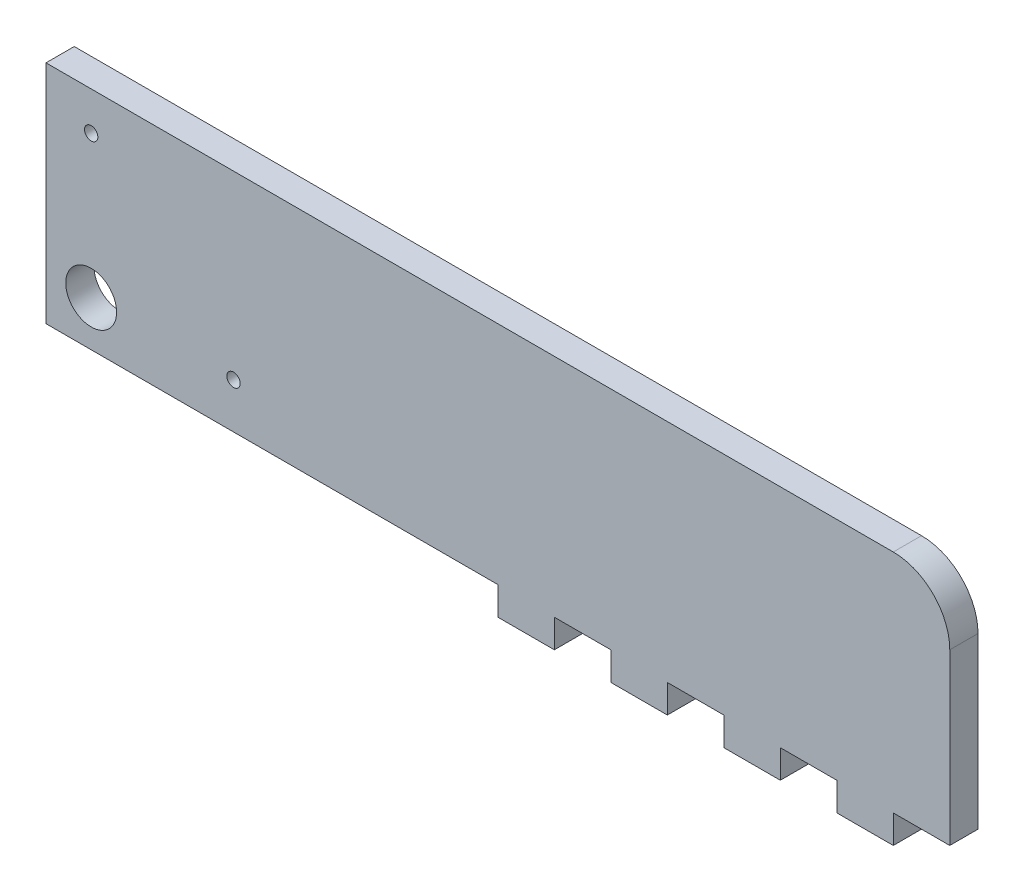
ISO-10303-21;
HEADER;
FILE_DESCRIPTION(('STEP AP214'),'2;1');
FILE_NAME('part.step','',(''),(''),'','','');
FILE_SCHEMA(('AUTOMOTIVE_DESIGN { 1 0 10303 214 1 1 1 1 }'));
ENDSEC;
DATA;
#1=APPLICATION_CONTEXT('core data for automotive mechanical design processes');
#2=APPLICATION_PROTOCOL_DEFINITION('international standard','automotive_design',2000,#1);
#3=PRODUCT_CONTEXT('',#1,'mechanical');
#4=PRODUCT('Part','Part','',(#3));
#5=PRODUCT_RELATED_PRODUCT_CATEGORY('part','',(#4));
#6=PRODUCT_DEFINITION_FORMATION('','',#4);
#7=PRODUCT_DEFINITION_CONTEXT('part definition',#1,'design');
#8=PRODUCT_DEFINITION('design','',#6,#7);
#9=PRODUCT_DEFINITION_SHAPE('','',#8);
#10=(LENGTH_UNIT() NAMED_UNIT(*) SI_UNIT(.MILLI.,.METRE.));
#11=(NAMED_UNIT(*) PLANE_ANGLE_UNIT() SI_UNIT($,.RADIAN.));
#12=(NAMED_UNIT(*) SI_UNIT($,.STERADIAN.) SOLID_ANGLE_UNIT());
#13=UNCERTAINTY_MEASURE_WITH_UNIT(LENGTH_MEASURE(1.E-05),#10,'distance_accuracy_value','');
#14=(GEOMETRIC_REPRESENTATION_CONTEXT(3) GLOBAL_UNCERTAINTY_ASSIGNED_CONTEXT((#13)) GLOBAL_UNIT_ASSIGNED_CONTEXT((#10,
#11,#12)) REPRESENTATION_CONTEXT('',''));
#15=CARTESIAN_POINT('',(0.,0.,0.));
#16=DIRECTION('',(0.,0.,1.));
#17=DIRECTION('',(1.,0.,0.));
#18=AXIS2_PLACEMENT_3D('',#15,#16,#17);
#19=CARTESIAN_POINT('',(0.,25.4,3.175));
#20=DIRECTION('',(0.,0.,-1.));
#21=DIRECTION('',(-1.,0.,0.));
#22=AXIS2_PLACEMENT_3D('',#19,#20,#21);
#23=PLANE('',#22);
#24=CARTESIAN_POINT('',(5.08,21.08,3.175));
#25=DIRECTION('',(0.,0.,1.));
#26=DIRECTION('',(1.,0.,0.));
#27=AXIS2_PLACEMENT_3D('',#24,#25,#26);
#28=CIRCLE('',#27,0.75);
#29=CARTESIAN_POINT('',(5.83,21.08,3.175));
#30=VERTEX_POINT('',#29);
#31=EDGE_CURVE('E334',#30,#30,#28,.T.);
#32=ORIENTED_EDGE('',*,*,#31,.F.);
#33=EDGE_LOOP('',(#32));
#34=FACE_BOUND('',#33,.T.);
#35=DIRECTION('',(0.,1.,0.));
#36=VECTOR('',#35,1.);
#37=CARTESIAN_POINT('',(101.6,0.,3.175));
#38=LINE('',#37,#36);
#39=CARTESIAN_POINT('',(101.6,0.,3.175));
#40=VERTEX_POINT('',#39);
#41=CARTESIAN_POINT('',(101.6,19.05,3.175));
#42=VERTEX_POINT('',#41);
#43=EDGE_CURVE('E298',#40,#42,#38,.T.);
#44=ORIENTED_EDGE('',*,*,#43,.T.);
#45=CARTESIAN_POINT('',(95.25,19.05,3.175));
#46=DIRECTION('',(0.,0.,-1.));
#47=DIRECTION('',(-1.,0.,0.));
#48=AXIS2_PLACEMENT_3D('',#45,#46,#47);
#49=CIRCLE('',#48,6.35);
#50=CARTESIAN_POINT('',(95.25,25.4,3.175));
#51=VERTEX_POINT('',#50);
#52=EDGE_CURVE('E11',#42,#51,#49,.F.);
#53=ORIENTED_EDGE('',*,*,#52,.T.);
#54=DIRECTION('',(-1.,0.,0.));
#55=VECTOR('',#54,1.);
#56=CARTESIAN_POINT('',(0.,25.4,3.175));
#57=LINE('',#56,#55);
#58=CARTESIAN_POINT('',(0.,25.4,3.175));
#59=VERTEX_POINT('',#58);
#60=EDGE_CURVE('E192',#51,#59,#57,.T.);
#61=ORIENTED_EDGE('',*,*,#60,.T.);
#62=DIRECTION('',(0.,-1.,0.));
#63=VECTOR('',#62,1.);
#64=CARTESIAN_POINT('',(0.,0.,3.175));
#65=LINE('',#64,#63);
#66=CARTESIAN_POINT('',(0.,0.,3.175));
#67=VERTEX_POINT('',#66);
#68=EDGE_CURVE('E187',#59,#67,#65,.T.);
#69=ORIENTED_EDGE('',*,*,#68,.T.);
#70=DIRECTION('',(1.,0.,0.));
#71=VECTOR('',#70,1.);
#72=CARTESIAN_POINT('',(0.,0.,3.175));
#73=LINE('',#72,#71);
#74=CARTESIAN_POINT('',(50.8,0.,3.175));
#75=VERTEX_POINT('',#74);
#76=EDGE_CURVE('E176',#67,#75,#73,.T.);
#77=ORIENTED_EDGE('',*,*,#76,.T.);
#78=DIRECTION('',(0.,-1.,0.));
#79=VECTOR('',#78,1.);
#80=CARTESIAN_POINT('',(50.8,-3.17500000000001,3.175));
#81=LINE('',#80,#79);
#82=CARTESIAN_POINT('',(50.8,-3.17500000000001,3.175));
#83=VERTEX_POINT('',#82);
#84=EDGE_CURVE('E186',#75,#83,#81,.T.);
#85=ORIENTED_EDGE('',*,*,#84,.T.);
#86=DIRECTION('',(1.,0.,0.));
#87=VECTOR('',#86,1.);
#88=CARTESIAN_POINT('',(57.15,-3.175,3.175));
#89=LINE('',#88,#87);
#90=CARTESIAN_POINT('',(57.15,-3.175,3.175));
#91=VERTEX_POINT('',#90);
#92=EDGE_CURVE('E328',#83,#91,#89,.T.);
#93=ORIENTED_EDGE('',*,*,#92,.T.);
#94=DIRECTION('',(0.,1.,0.));
#95=VECTOR('',#94,1.);
#96=CARTESIAN_POINT('',(57.15,0.,3.175));
#97=LINE('',#96,#95);
#98=CARTESIAN_POINT('',(57.15,0.,3.175));
#99=VERTEX_POINT('',#98);
#100=EDGE_CURVE('E326',#91,#99,#97,.T.);
#101=ORIENTED_EDGE('',*,*,#100,.T.);
#102=DIRECTION('',(1.,0.,0.));
#103=VECTOR('',#102,1.);
#104=CARTESIAN_POINT('',(57.15,0.,3.175));
#105=LINE('',#104,#103);
#106=CARTESIAN_POINT('',(63.5,0.,3.175));
#107=VERTEX_POINT('',#106);
#108=EDGE_CURVE('E324',#99,#107,#105,.T.);
#109=ORIENTED_EDGE('',*,*,#108,.T.);
#110=DIRECTION('',(0.,-1.,0.));
#111=VECTOR('',#110,1.);
#112=CARTESIAN_POINT('',(63.5,-3.175,3.175));
#113=LINE('',#112,#111);
#114=CARTESIAN_POINT('',(63.5,-3.175,3.175));
#115=VERTEX_POINT('',#114);
#116=EDGE_CURVE('E322',#107,#115,#113,.T.);
#117=ORIENTED_EDGE('',*,*,#116,.T.);
#118=DIRECTION('',(1.,0.,0.));
#119=VECTOR('',#118,1.);
#120=CARTESIAN_POINT('',(69.85,-3.175,3.175));
#121=LINE('',#120,#119);
#122=CARTESIAN_POINT('',(69.85,-3.175,3.175));
#123=VERTEX_POINT('',#122);
#124=EDGE_CURVE('E320',#115,#123,#121,.T.);
#125=ORIENTED_EDGE('',*,*,#124,.T.);
#126=DIRECTION('',(0.,1.,0.));
#127=VECTOR('',#126,1.);
#128=CARTESIAN_POINT('',(69.85,0.,3.175));
#129=LINE('',#128,#127);
#130=CARTESIAN_POINT('',(69.85,0.,3.175));
#131=VERTEX_POINT('',#130);
#132=EDGE_CURVE('E318',#123,#131,#129,.T.);
#133=ORIENTED_EDGE('',*,*,#132,.T.);
#134=DIRECTION('',(1.,0.,0.));
#135=VECTOR('',#134,1.);
#136=CARTESIAN_POINT('',(69.85,0.,3.175));
#137=LINE('',#136,#135);
#138=CARTESIAN_POINT('',(76.2,0.,3.175));
#139=VERTEX_POINT('',#138);
#140=EDGE_CURVE('E316',#131,#139,#137,.T.);
#141=ORIENTED_EDGE('',*,*,#140,.T.);
#142=DIRECTION('',(0.,-1.,0.));
#143=VECTOR('',#142,1.);
#144=CARTESIAN_POINT('',(76.2,-3.175,3.175));
#145=LINE('',#144,#143);
#146=CARTESIAN_POINT('',(76.2,-3.175,3.175));
#147=VERTEX_POINT('',#146);
#148=EDGE_CURVE('E314',#139,#147,#145,.T.);
#149=ORIENTED_EDGE('',*,*,#148,.T.);
#150=DIRECTION('',(1.,0.,0.));
#151=VECTOR('',#150,1.);
#152=CARTESIAN_POINT('',(82.55,-3.175,3.175));
#153=LINE('',#152,#151);
#154=CARTESIAN_POINT('',(82.55,-3.175,3.175));
#155=VERTEX_POINT('',#154);
#156=EDGE_CURVE('E312',#147,#155,#153,.T.);
#157=ORIENTED_EDGE('',*,*,#156,.T.);
#158=DIRECTION('',(0.,1.,0.));
#159=VECTOR('',#158,1.);
#160=CARTESIAN_POINT('',(82.55,0.,3.175));
#161=LINE('',#160,#159);
#162=CARTESIAN_POINT('',(82.55,0.,3.175));
#163=VERTEX_POINT('',#162);
#164=EDGE_CURVE('E310',#155,#163,#161,.T.);
#165=ORIENTED_EDGE('',*,*,#164,.T.);
#166=DIRECTION('',(1.,0.,0.));
#167=VECTOR('',#166,1.);
#168=CARTESIAN_POINT('',(82.55,0.,3.175));
#169=LINE('',#168,#167);
#170=CARTESIAN_POINT('',(88.9,0.,3.175));
#171=VERTEX_POINT('',#170);
#172=EDGE_CURVE('E308',#163,#171,#169,.T.);
#173=ORIENTED_EDGE('',*,*,#172,.T.);
#174=DIRECTION('',(0.,-1.,0.));
#175=VECTOR('',#174,1.);
#176=CARTESIAN_POINT('',(88.9,-3.175,3.175));
#177=LINE('',#176,#175);
#178=CARTESIAN_POINT('',(88.9,-3.175,3.175));
#179=VERTEX_POINT('',#178);
#180=EDGE_CURVE('E306',#171,#179,#177,.T.);
#181=ORIENTED_EDGE('',*,*,#180,.T.);
#182=DIRECTION('',(1.,0.,0.));
#183=VECTOR('',#182,1.);
#184=CARTESIAN_POINT('',(95.25,-3.175,3.175));
#185=LINE('',#184,#183);
#186=CARTESIAN_POINT('',(95.25,-3.175,3.175));
#187=VERTEX_POINT('',#186);
#188=EDGE_CURVE('E304',#179,#187,#185,.T.);
#189=ORIENTED_EDGE('',*,*,#188,.T.);
#190=DIRECTION('',(0.,1.,0.));
#191=VECTOR('',#190,1.);
#192=CARTESIAN_POINT('',(95.25,0.,3.175));
#193=LINE('',#192,#191);
#194=CARTESIAN_POINT('',(95.25,0.,3.175));
#195=VERTEX_POINT('',#194);
#196=EDGE_CURVE('E302',#187,#195,#193,.T.);
#197=ORIENTED_EDGE('',*,*,#196,.T.);
#198=DIRECTION('',(1.,0.,0.));
#199=VECTOR('',#198,1.);
#200=CARTESIAN_POINT('',(95.25,0.,3.175));
#201=LINE('',#200,#199);
#202=EDGE_CURVE('E300',#195,#40,#201,.T.);
#203=ORIENTED_EDGE('',*,*,#202,.T.);
#204=EDGE_LOOP('',(#44,#53,#61,#69,#77,#85,#93,#101,#109,#117,#125,#133,#141,#149,#157,#165,
#173,#181,#189,#197,#203));
#205=FACE_BOUND('',#204,.T.);
#206=CARTESIAN_POINT('',(5.08,5.08,3.175));
#207=DIRECTION('',(0.,0.,1.));
#208=DIRECTION('',(1.,0.,0.));
#209=AXIS2_PLACEMENT_3D('',#206,#207,#208);
#210=CIRCLE('',#209,2.8575);
#211=CARTESIAN_POINT('',(7.9375,5.08,3.175));
#212=VERTEX_POINT('',#211);
#213=EDGE_CURVE('E296',#212,#212,#210,.T.);
#214=ORIENTED_EDGE('',*,*,#213,.F.);
#215=EDGE_LOOP('',(#214));
#216=FACE_BOUND('',#215,.T.);
#217=CARTESIAN_POINT('',(21.08,5.08,3.175));
#218=DIRECTION('',(0.,0.,1.));
#219=DIRECTION('',(1.,0.,0.));
#220=AXIS2_PLACEMENT_3D('',#217,#218,#219);
#221=CIRCLE('',#220,0.750000000000002);
#222=CARTESIAN_POINT('',(21.83,5.08,3.175));
#223=VERTEX_POINT('',#222);
#224=EDGE_CURVE('E340',#223,#223,#221,.T.);
#225=ORIENTED_EDGE('',*,*,#224,.F.);
#226=EDGE_LOOP('',(#225));
#227=FACE_BOUND('',#226,.T.);
#228=ADVANCED_FACE('F33',(#34,#205,#216,#227),#23,.F.);
#229=CARTESIAN_POINT('',(0.,25.4,0.));
#230=DIRECTION('',(0.,0.,-1.));
#231=DIRECTION('',(-1.,0.,0.));
#232=AXIS2_PLACEMENT_3D('',#229,#230,#231);
#233=PLANE('',#232);
#234=CARTESIAN_POINT('',(5.08,21.08,0.));
#235=DIRECTION('',(0.,0.,1.));
#236=DIRECTION('',(1.,0.,0.));
#237=AXIS2_PLACEMENT_3D('',#234,#235,#236);
#238=CIRCLE('',#237,0.75);
#239=CARTESIAN_POINT('',(5.83,21.08,0.));
#240=VERTEX_POINT('',#239);
#241=EDGE_CURVE('E337',#240,#240,#238,.T.);
#242=ORIENTED_EDGE('',*,*,#241,.T.);
#243=EDGE_LOOP('',(#242));
#244=FACE_BOUND('',#243,.T.);
#245=DIRECTION('',(-1.,0.,0.));
#246=VECTOR('',#245,1.);
#247=CARTESIAN_POINT('',(0.,25.4,0.));
#248=LINE('',#247,#246);
#249=CARTESIAN_POINT('',(95.25,25.4,0.));
#250=VERTEX_POINT('',#249);
#251=CARTESIAN_POINT('',(0.,25.4,0.));
#252=VERTEX_POINT('',#251);
#253=EDGE_CURVE('E196',#250,#252,#248,.T.);
#254=ORIENTED_EDGE('',*,*,#253,.F.);
#255=CARTESIAN_POINT('',(95.25,19.05,0.));
#256=DIRECTION('',(0.,0.,-1.));
#257=DIRECTION('',(-1.,0.,0.));
#258=AXIS2_PLACEMENT_3D('',#255,#256,#257);
#259=CIRCLE('',#258,6.35);
#260=CARTESIAN_POINT('',(101.6,19.05,0.));
#261=VERTEX_POINT('',#260);
#262=EDGE_CURVE('E55',#250,#261,#259,.T.);
#263=ORIENTED_EDGE('',*,*,#262,.T.);
#264=DIRECTION('',(0.,1.,0.));
#265=VECTOR('',#264,1.);
#266=CARTESIAN_POINT('',(101.6,0.,0.));
#267=LINE('',#266,#265);
#268=CARTESIAN_POINT('',(101.6,0.,0.));
#269=VERTEX_POINT('',#268);
#270=EDGE_CURVE('E259',#269,#261,#267,.T.);
#271=ORIENTED_EDGE('',*,*,#270,.F.);
#272=DIRECTION('',(1.,0.,0.));
#273=VECTOR('',#272,1.);
#274=CARTESIAN_POINT('',(95.25,0.,0.));
#275=LINE('',#274,#273);
#276=CARTESIAN_POINT('',(95.25,0.,0.));
#277=VERTEX_POINT('',#276);
#278=EDGE_CURVE('E261',#277,#269,#275,.T.);
#279=ORIENTED_EDGE('',*,*,#278,.F.);
#280=DIRECTION('',(0.,1.,0.));
#281=VECTOR('',#280,1.);
#282=CARTESIAN_POINT('',(95.25,0.,0.));
#283=LINE('',#282,#281);
#284=CARTESIAN_POINT('',(95.25,-3.175,0.));
#285=VERTEX_POINT('',#284);
#286=EDGE_CURVE('E263',#285,#277,#283,.T.);
#287=ORIENTED_EDGE('',*,*,#286,.F.);
#288=DIRECTION('',(1.,0.,0.));
#289=VECTOR('',#288,1.);
#290=CARTESIAN_POINT('',(95.25,-3.175,0.));
#291=LINE('',#290,#289);
#292=CARTESIAN_POINT('',(88.9,-3.175,0.));
#293=VERTEX_POINT('',#292);
#294=EDGE_CURVE('E265',#293,#285,#291,.T.);
#295=ORIENTED_EDGE('',*,*,#294,.F.);
#296=DIRECTION('',(0.,-1.,0.));
#297=VECTOR('',#296,1.);
#298=CARTESIAN_POINT('',(88.9,-3.175,0.));
#299=LINE('',#298,#297);
#300=CARTESIAN_POINT('',(88.9,0.,0.));
#301=VERTEX_POINT('',#300);
#302=EDGE_CURVE('E267',#301,#293,#299,.T.);
#303=ORIENTED_EDGE('',*,*,#302,.F.);
#304=DIRECTION('',(1.,0.,0.));
#305=VECTOR('',#304,1.);
#306=CARTESIAN_POINT('',(82.55,0.,0.));
#307=LINE('',#306,#305);
#308=CARTESIAN_POINT('',(82.55,0.,0.));
#309=VERTEX_POINT('',#308);
#310=EDGE_CURVE('E269',#309,#301,#307,.T.);
#311=ORIENTED_EDGE('',*,*,#310,.F.);
#312=DIRECTION('',(0.,1.,0.));
#313=VECTOR('',#312,1.);
#314=CARTESIAN_POINT('',(82.55,0.,0.));
#315=LINE('',#314,#313);
#316=CARTESIAN_POINT('',(82.55,-3.175,0.));
#317=VERTEX_POINT('',#316);
#318=EDGE_CURVE('E271',#317,#309,#315,.T.);
#319=ORIENTED_EDGE('',*,*,#318,.F.);
#320=DIRECTION('',(1.,0.,0.));
#321=VECTOR('',#320,1.);
#322=CARTESIAN_POINT('',(82.55,-3.175,0.));
#323=LINE('',#322,#321);
#324=CARTESIAN_POINT('',(76.2,-3.175,0.));
#325=VERTEX_POINT('',#324);
#326=EDGE_CURVE('E273',#325,#317,#323,.T.);
#327=ORIENTED_EDGE('',*,*,#326,.F.);
#328=DIRECTION('',(0.,-1.,0.));
#329=VECTOR('',#328,1.);
#330=CARTESIAN_POINT('',(76.2,-3.175,0.));
#331=LINE('',#330,#329);
#332=CARTESIAN_POINT('',(76.2,0.,0.));
#333=VERTEX_POINT('',#332);
#334=EDGE_CURVE('E275',#333,#325,#331,.T.);
#335=ORIENTED_EDGE('',*,*,#334,.F.);
#336=DIRECTION('',(1.,0.,0.));
#337=VECTOR('',#336,1.);
#338=CARTESIAN_POINT('',(69.85,0.,0.));
#339=LINE('',#338,#337);
#340=CARTESIAN_POINT('',(69.85,0.,0.));
#341=VERTEX_POINT('',#340);
#342=EDGE_CURVE('E277',#341,#333,#339,.T.);
#343=ORIENTED_EDGE('',*,*,#342,.F.);
#344=DIRECTION('',(0.,1.,0.));
#345=VECTOR('',#344,1.);
#346=CARTESIAN_POINT('',(69.85,0.,0.));
#347=LINE('',#346,#345);
#348=CARTESIAN_POINT('',(69.85,-3.175,0.));
#349=VERTEX_POINT('',#348);
#350=EDGE_CURVE('E279',#349,#341,#347,.T.);
#351=ORIENTED_EDGE('',*,*,#350,.F.);
#352=DIRECTION('',(1.,0.,0.));
#353=VECTOR('',#352,1.);
#354=CARTESIAN_POINT('',(69.85,-3.175,0.));
#355=LINE('',#354,#353);
#356=CARTESIAN_POINT('',(63.5,-3.175,0.));
#357=VERTEX_POINT('',#356);
#358=EDGE_CURVE('E281',#357,#349,#355,.T.);
#359=ORIENTED_EDGE('',*,*,#358,.F.);
#360=DIRECTION('',(0.,-1.,0.));
#361=VECTOR('',#360,1.);
#362=CARTESIAN_POINT('',(63.5,-3.175,0.));
#363=LINE('',#362,#361);
#364=CARTESIAN_POINT('',(63.5,0.,0.));
#365=VERTEX_POINT('',#364);
#366=EDGE_CURVE('E283',#365,#357,#363,.T.);
#367=ORIENTED_EDGE('',*,*,#366,.F.);
#368=DIRECTION('',(1.,0.,0.));
#369=VECTOR('',#368,1.);
#370=CARTESIAN_POINT('',(57.15,0.,0.));
#371=LINE('',#370,#369);
#372=CARTESIAN_POINT('',(57.15,0.,0.));
#373=VERTEX_POINT('',#372);
#374=EDGE_CURVE('E285',#373,#365,#371,.T.);
#375=ORIENTED_EDGE('',*,*,#374,.F.);
#376=DIRECTION('',(0.,1.,0.));
#377=VECTOR('',#376,1.);
#378=CARTESIAN_POINT('',(57.15,0.,0.));
#379=LINE('',#378,#377);
#380=CARTESIAN_POINT('',(57.15,-3.175,0.));
#381=VERTEX_POINT('',#380);
#382=EDGE_CURVE('E287',#381,#373,#379,.T.);
#383=ORIENTED_EDGE('',*,*,#382,.F.);
#384=DIRECTION('',(1.,0.,0.));
#385=VECTOR('',#384,1.);
#386=CARTESIAN_POINT('',(57.15,-3.175,0.));
#387=LINE('',#386,#385);
#388=CARTESIAN_POINT('',(50.8,-3.17500000000001,0.));
#389=VERTEX_POINT('',#388);
#390=EDGE_CURVE('E289',#389,#381,#387,.T.);
#391=ORIENTED_EDGE('',*,*,#390,.F.);
#392=DIRECTION('',(0.,-1.,0.));
#393=VECTOR('',#392,1.);
#394=CARTESIAN_POINT('',(50.8,-3.17500000000001,0.));
#395=LINE('',#394,#393);
#396=CARTESIAN_POINT('',(50.8,0.,0.));
#397=VERTEX_POINT('',#396);
#398=EDGE_CURVE('E291',#397,#389,#395,.T.);
#399=ORIENTED_EDGE('',*,*,#398,.F.);
#400=DIRECTION('',(1.,0.,0.));
#401=VECTOR('',#400,1.);
#402=CARTESIAN_POINT('',(44.45,-6.20785382046308E-13,0.));
#403=LINE('',#402,#401);
#404=CARTESIAN_POINT('',(0.,0.,0.));
#405=VERTEX_POINT('',#404);
#406=EDGE_CURVE('E293',#405,#397,#403,.T.);
#407=ORIENTED_EDGE('',*,*,#406,.F.);
#408=DIRECTION('',(0.,-1.,0.));
#409=VECTOR('',#408,1.);
#410=CARTESIAN_POINT('',(0.,0.,0.));
#411=LINE('',#410,#409);
#412=EDGE_CURVE('E200',#252,#405,#411,.T.);
#413=ORIENTED_EDGE('',*,*,#412,.F.);
#414=EDGE_LOOP('',(#254,#263,#271,#279,#287,#295,#303,#311,#319,#327,#335,#343,#351,#359,#367,
#375,#383,#391,#399,#407,#413));
#415=FACE_BOUND('',#414,.T.);
#416=CARTESIAN_POINT('',(5.08,5.08,0.));
#417=DIRECTION('',(0.,0.,1.));
#418=DIRECTION('',(1.,0.,0.));
#419=AXIS2_PLACEMENT_3D('',#416,#417,#418);
#420=CIRCLE('',#419,2.8575);
#421=CARTESIAN_POINT('',(7.9375,5.08,0.));
#422=VERTEX_POINT('',#421);
#423=EDGE_CURVE('E331',#422,#422,#420,.T.);
#424=ORIENTED_EDGE('',*,*,#423,.T.);
#425=EDGE_LOOP('',(#424));
#426=FACE_BOUND('',#425,.T.);
#427=CARTESIAN_POINT('',(21.08,5.08,0.));
#428=DIRECTION('',(0.,0.,1.));
#429=DIRECTION('',(1.,0.,0.));
#430=AXIS2_PLACEMENT_3D('',#427,#428,#429);
#431=CIRCLE('',#430,0.750000000000002);
#432=CARTESIAN_POINT('',(21.83,5.08,0.));
#433=VERTEX_POINT('',#432);
#434=EDGE_CURVE('E343',#433,#433,#431,.T.);
#435=ORIENTED_EDGE('',*,*,#434,.T.);
#436=EDGE_LOOP('',(#435));
#437=FACE_BOUND('',#436,.T.);
#438=ADVANCED_FACE('F353',(#244,#415,#426,#437),#233,.T.);
#439=CARTESIAN_POINT('',(0.,0.,3.175));
#440=DIRECTION('',(1.,0.,0.));
#441=DIRECTION('',(0.,0.,-1.));
#442=AXIS2_PLACEMENT_3D('',#439,#440,#441);
#443=PLANE('',#442);
#444=ORIENTED_EDGE('',*,*,#412,.T.);
#445=DIRECTION('',(0.,0.,-1.));
#446=VECTOR('',#445,1.);
#447=CARTESIAN_POINT('',(0.,0.,3.175));
#448=LINE('',#447,#446);
#449=EDGE_CURVE('E180',#67,#405,#448,.T.);
#450=ORIENTED_EDGE('',*,*,#449,.F.);
#451=ORIENTED_EDGE('',*,*,#68,.F.);
#452=DIRECTION('',(0.,0.,-1.));
#453=VECTOR('',#452,1.);
#454=CARTESIAN_POINT('',(0.,25.4,3.175));
#455=LINE('',#454,#453);
#456=EDGE_CURVE('E256',#59,#252,#455,.T.);
#457=ORIENTED_EDGE('',*,*,#456,.T.);
#458=EDGE_LOOP('',(#444,#450,#451,#457));
#459=FACE_BOUND('',#458,.T.);
#460=ADVANCED_FACE('F198',(#459),#443,.F.);
#461=CARTESIAN_POINT('',(44.45,-6.20785382046308E-13,3.175));
#462=DIRECTION('',(0.,1.,0.));
#463=DIRECTION('',(-1.,0.,0.));
#464=AXIS2_PLACEMENT_3D('',#461,#462,#463);
#465=PLANE('',#464);
#466=ORIENTED_EDGE('',*,*,#406,.T.);
#467=DIRECTION('',(0.,0.,-1.));
#468=VECTOR('',#467,1.);
#469=CARTESIAN_POINT('',(50.8,0.,3.175));
#470=LINE('',#469,#468);
#471=EDGE_CURVE('E183',#75,#397,#470,.T.);
#472=ORIENTED_EDGE('',*,*,#471,.F.);
#473=ORIENTED_EDGE('',*,*,#76,.F.);
#474=ORIENTED_EDGE('',*,*,#449,.T.);
#475=EDGE_LOOP('',(#466,#472,#473,#474));
#476=FACE_BOUND('',#475,.T.);
#477=ADVANCED_FACE('F178',(#476),#465,.F.);
#478=CARTESIAN_POINT('',(50.8,-3.17500000000001,3.175));
#479=DIRECTION('',(1.,0.,0.));
#480=DIRECTION('',(0.,0.,-1.));
#481=AXIS2_PLACEMENT_3D('',#478,#479,#480);
#482=PLANE('',#481);
#483=ORIENTED_EDGE('',*,*,#398,.T.);
#484=DIRECTION('',(0.,0.,-1.));
#485=VECTOR('',#484,1.);
#486=CARTESIAN_POINT('',(50.8,-3.17500000000001,3.175));
#487=LINE('',#486,#485);
#488=EDGE_CURVE('E205',#83,#389,#487,.T.);
#489=ORIENTED_EDGE('',*,*,#488,.F.);
#490=ORIENTED_EDGE('',*,*,#84,.F.);
#491=ORIENTED_EDGE('',*,*,#471,.T.);
#492=EDGE_LOOP('',(#483,#489,#490,#491));
#493=FACE_BOUND('',#492,.T.);
#494=ADVANCED_FACE('F433',(#493),#482,.F.);
#495=CARTESIAN_POINT('',(57.15,-3.175,3.175));
#496=DIRECTION('',(0.,1.,0.));
#497=DIRECTION('',(-1.,0.,0.));
#498=AXIS2_PLACEMENT_3D('',#495,#496,#497);
#499=PLANE('',#498);
#500=ORIENTED_EDGE('',*,*,#390,.T.);
#501=DIRECTION('',(0.,0.,-1.));
#502=VECTOR('',#501,1.);
#503=CARTESIAN_POINT('',(57.15,-3.175,3.175));
#504=LINE('',#503,#502);
#505=EDGE_CURVE('E211',#91,#381,#504,.T.);
#506=ORIENTED_EDGE('',*,*,#505,.F.);
#507=ORIENTED_EDGE('',*,*,#92,.F.);
#508=ORIENTED_EDGE('',*,*,#488,.T.);
#509=EDGE_LOOP('',(#500,#506,#507,#508));
#510=FACE_BOUND('',#509,.T.);
#511=ADVANCED_FACE('F429',(#510),#499,.F.);
#512=CARTESIAN_POINT('',(57.15,0.,3.175));
#513=DIRECTION('',(-1.,0.,0.));
#514=DIRECTION('',(0.,-1.,0.));
#515=AXIS2_PLACEMENT_3D('',#512,#513,#514);
#516=PLANE('',#515);
#517=ORIENTED_EDGE('',*,*,#382,.T.);
#518=DIRECTION('',(0.,0.,-1.));
#519=VECTOR('',#518,1.);
#520=CARTESIAN_POINT('',(57.15,0.,3.175));
#521=LINE('',#520,#519);
#522=EDGE_CURVE('E214',#99,#373,#521,.T.);
#523=ORIENTED_EDGE('',*,*,#522,.F.);
#524=ORIENTED_EDGE('',*,*,#100,.F.);
#525=ORIENTED_EDGE('',*,*,#505,.T.);
#526=EDGE_LOOP('',(#517,#523,#524,#525));
#527=FACE_BOUND('',#526,.T.);
#528=ADVANCED_FACE('F425',(#527),#516,.F.);
#529=CARTESIAN_POINT('',(57.15,0.,3.175));
#530=DIRECTION('',(0.,1.,0.));
#531=DIRECTION('',(-1.,0.,0.));
#532=AXIS2_PLACEMENT_3D('',#529,#530,#531);
#533=PLANE('',#532);
#534=ORIENTED_EDGE('',*,*,#374,.T.);
#535=DIRECTION('',(0.,0.,-1.));
#536=VECTOR('',#535,1.);
#537=CARTESIAN_POINT('',(63.5,0.,3.175));
#538=LINE('',#537,#536);
#539=EDGE_CURVE('E217',#107,#365,#538,.T.);
#540=ORIENTED_EDGE('',*,*,#539,.F.);
#541=ORIENTED_EDGE('',*,*,#108,.F.);
#542=ORIENTED_EDGE('',*,*,#522,.T.);
#543=EDGE_LOOP('',(#534,#540,#541,#542));
#544=FACE_BOUND('',#543,.T.);
#545=ADVANCED_FACE('F421',(#544),#533,.F.);
#546=CARTESIAN_POINT('',(63.5,-3.175,3.175));
#547=DIRECTION('',(1.,0.,0.));
#548=DIRECTION('',(0.,0.,-1.));
#549=AXIS2_PLACEMENT_3D('',#546,#547,#548);
#550=PLANE('',#549);
#551=ORIENTED_EDGE('',*,*,#366,.T.);
#552=DIRECTION('',(0.,0.,-1.));
#553=VECTOR('',#552,1.);
#554=CARTESIAN_POINT('',(63.5,-3.175,3.175));
#555=LINE('',#554,#553);
#556=EDGE_CURVE('E220',#115,#357,#555,.T.);
#557=ORIENTED_EDGE('',*,*,#556,.F.);
#558=ORIENTED_EDGE('',*,*,#116,.F.);
#559=ORIENTED_EDGE('',*,*,#539,.T.);
#560=EDGE_LOOP('',(#551,#557,#558,#559));
#561=FACE_BOUND('',#560,.T.);
#562=ADVANCED_FACE('F417',(#561),#550,.F.);
#563=CARTESIAN_POINT('',(69.85,-3.175,3.175));
#564=DIRECTION('',(0.,1.,0.));
#565=DIRECTION('',(-1.,0.,0.));
#566=AXIS2_PLACEMENT_3D('',#563,#564,#565);
#567=PLANE('',#566);
#568=ORIENTED_EDGE('',*,*,#358,.T.);
#569=DIRECTION('',(0.,0.,-1.));
#570=VECTOR('',#569,1.);
#571=CARTESIAN_POINT('',(69.85,-3.175,3.175));
#572=LINE('',#571,#570);
#573=EDGE_CURVE('E223',#123,#349,#572,.T.);
#574=ORIENTED_EDGE('',*,*,#573,.F.);
#575=ORIENTED_EDGE('',*,*,#124,.F.);
#576=ORIENTED_EDGE('',*,*,#556,.T.);
#577=EDGE_LOOP('',(#568,#574,#575,#576));
#578=FACE_BOUND('',#577,.T.);
#579=ADVANCED_FACE('F413',(#578),#567,.F.);
#580=CARTESIAN_POINT('',(69.85,0.,3.175));
#581=DIRECTION('',(-1.,0.,0.));
#582=DIRECTION('',(0.,-1.,0.));
#583=AXIS2_PLACEMENT_3D('',#580,#581,#582);
#584=PLANE('',#583);
#585=ORIENTED_EDGE('',*,*,#350,.T.);
#586=DIRECTION('',(0.,0.,-1.));
#587=VECTOR('',#586,1.);
#588=CARTESIAN_POINT('',(69.85,0.,3.175));
#589=LINE('',#588,#587);
#590=EDGE_CURVE('E226',#131,#341,#589,.T.);
#591=ORIENTED_EDGE('',*,*,#590,.F.);
#592=ORIENTED_EDGE('',*,*,#132,.F.);
#593=ORIENTED_EDGE('',*,*,#573,.T.);
#594=EDGE_LOOP('',(#585,#591,#592,#593));
#595=FACE_BOUND('',#594,.T.);
#596=ADVANCED_FACE('F409',(#595),#584,.F.);
#597=CARTESIAN_POINT('',(69.85,0.,3.175));
#598=DIRECTION('',(0.,1.,0.));
#599=DIRECTION('',(-1.,0.,0.));
#600=AXIS2_PLACEMENT_3D('',#597,#598,#599);
#601=PLANE('',#600);
#602=ORIENTED_EDGE('',*,*,#342,.T.);
#603=DIRECTION('',(0.,0.,-1.));
#604=VECTOR('',#603,1.);
#605=CARTESIAN_POINT('',(76.2,0.,3.175));
#606=LINE('',#605,#604);
#607=EDGE_CURVE('E229',#139,#333,#606,.T.);
#608=ORIENTED_EDGE('',*,*,#607,.F.);
#609=ORIENTED_EDGE('',*,*,#140,.F.);
#610=ORIENTED_EDGE('',*,*,#590,.T.);
#611=EDGE_LOOP('',(#602,#608,#609,#610));
#612=FACE_BOUND('',#611,.T.);
#613=ADVANCED_FACE('F405',(#612),#601,.F.);
#614=CARTESIAN_POINT('',(76.2,-3.175,3.175));
#615=DIRECTION('',(1.,0.,0.));
#616=DIRECTION('',(0.,0.,-1.));
#617=AXIS2_PLACEMENT_3D('',#614,#615,#616);
#618=PLANE('',#617);
#619=ORIENTED_EDGE('',*,*,#334,.T.);
#620=DIRECTION('',(0.,0.,-1.));
#621=VECTOR('',#620,1.);
#622=CARTESIAN_POINT('',(76.2,-3.175,3.175));
#623=LINE('',#622,#621);
#624=EDGE_CURVE('E232',#147,#325,#623,.T.);
#625=ORIENTED_EDGE('',*,*,#624,.F.);
#626=ORIENTED_EDGE('',*,*,#148,.F.);
#627=ORIENTED_EDGE('',*,*,#607,.T.);
#628=EDGE_LOOP('',(#619,#625,#626,#627));
#629=FACE_BOUND('',#628,.T.);
#630=ADVANCED_FACE('F401',(#629),#618,.F.);
#631=CARTESIAN_POINT('',(82.55,-3.175,3.175));
#632=DIRECTION('',(0.,1.,0.));
#633=DIRECTION('',(-1.,0.,0.));
#634=AXIS2_PLACEMENT_3D('',#631,#632,#633);
#635=PLANE('',#634);
#636=ORIENTED_EDGE('',*,*,#326,.T.);
#637=DIRECTION('',(0.,0.,-1.));
#638=VECTOR('',#637,1.);
#639=CARTESIAN_POINT('',(82.55,-3.175,3.175));
#640=LINE('',#639,#638);
#641=EDGE_CURVE('E235',#155,#317,#640,.T.);
#642=ORIENTED_EDGE('',*,*,#641,.F.);
#643=ORIENTED_EDGE('',*,*,#156,.F.);
#644=ORIENTED_EDGE('',*,*,#624,.T.);
#645=EDGE_LOOP('',(#636,#642,#643,#644));
#646=FACE_BOUND('',#645,.T.);
#647=ADVANCED_FACE('F397',(#646),#635,.F.);
#648=CARTESIAN_POINT('',(82.55,0.,3.175));
#649=DIRECTION('',(-1.,0.,0.));
#650=DIRECTION('',(0.,-1.,0.));
#651=AXIS2_PLACEMENT_3D('',#648,#649,#650);
#652=PLANE('',#651);
#653=ORIENTED_EDGE('',*,*,#318,.T.);
#654=DIRECTION('',(0.,0.,-1.));
#655=VECTOR('',#654,1.);
#656=CARTESIAN_POINT('',(82.55,0.,3.175));
#657=LINE('',#656,#655);
#658=EDGE_CURVE('E238',#163,#309,#657,.T.);
#659=ORIENTED_EDGE('',*,*,#658,.F.);
#660=ORIENTED_EDGE('',*,*,#164,.F.);
#661=ORIENTED_EDGE('',*,*,#641,.T.);
#662=EDGE_LOOP('',(#653,#659,#660,#661));
#663=FACE_BOUND('',#662,.T.);
#664=ADVANCED_FACE('F393',(#663),#652,.F.);
#665=CARTESIAN_POINT('',(82.55,0.,3.175));
#666=DIRECTION('',(0.,1.,0.));
#667=DIRECTION('',(-1.,0.,0.));
#668=AXIS2_PLACEMENT_3D('',#665,#666,#667);
#669=PLANE('',#668);
#670=ORIENTED_EDGE('',*,*,#310,.T.);
#671=DIRECTION('',(0.,0.,-1.));
#672=VECTOR('',#671,1.);
#673=CARTESIAN_POINT('',(88.9,0.,3.175));
#674=LINE('',#673,#672);
#675=EDGE_CURVE('E241',#171,#301,#674,.T.);
#676=ORIENTED_EDGE('',*,*,#675,.F.);
#677=ORIENTED_EDGE('',*,*,#172,.F.);
#678=ORIENTED_EDGE('',*,*,#658,.T.);
#679=EDGE_LOOP('',(#670,#676,#677,#678));
#680=FACE_BOUND('',#679,.T.);
#681=ADVANCED_FACE('F389',(#680),#669,.F.);
#682=CARTESIAN_POINT('',(88.9,-3.175,3.175));
#683=DIRECTION('',(1.,0.,0.));
#684=DIRECTION('',(0.,0.,-1.));
#685=AXIS2_PLACEMENT_3D('',#682,#683,#684);
#686=PLANE('',#685);
#687=ORIENTED_EDGE('',*,*,#302,.T.);
#688=DIRECTION('',(0.,0.,-1.));
#689=VECTOR('',#688,1.);
#690=CARTESIAN_POINT('',(88.9,-3.175,3.175));
#691=LINE('',#690,#689);
#692=EDGE_CURVE('E244',#179,#293,#691,.T.);
#693=ORIENTED_EDGE('',*,*,#692,.F.);
#694=ORIENTED_EDGE('',*,*,#180,.F.);
#695=ORIENTED_EDGE('',*,*,#675,.T.);
#696=EDGE_LOOP('',(#687,#693,#694,#695));
#697=FACE_BOUND('',#696,.T.);
#698=ADVANCED_FACE('F385',(#697),#686,.F.);
#699=CARTESIAN_POINT('',(95.25,-3.175,3.175));
#700=DIRECTION('',(0.,1.,0.));
#701=DIRECTION('',(-1.,0.,0.));
#702=AXIS2_PLACEMENT_3D('',#699,#700,#701);
#703=PLANE('',#702);
#704=ORIENTED_EDGE('',*,*,#294,.T.);
#705=DIRECTION('',(0.,0.,-1.));
#706=VECTOR('',#705,1.);
#707=CARTESIAN_POINT('',(95.25,-3.175,3.175));
#708=LINE('',#707,#706);
#709=EDGE_CURVE('E247',#187,#285,#708,.T.);
#710=ORIENTED_EDGE('',*,*,#709,.F.);
#711=ORIENTED_EDGE('',*,*,#188,.F.);
#712=ORIENTED_EDGE('',*,*,#692,.T.);
#713=EDGE_LOOP('',(#704,#710,#711,#712));
#714=FACE_BOUND('',#713,.T.);
#715=ADVANCED_FACE('F381',(#714),#703,.F.);
#716=CARTESIAN_POINT('',(95.25,0.,3.175));
#717=DIRECTION('',(-1.,0.,0.));
#718=DIRECTION('',(0.,0.,1.));
#719=AXIS2_PLACEMENT_3D('',#716,#717,#718);
#720=PLANE('',#719);
#721=ORIENTED_EDGE('',*,*,#286,.T.);
#722=DIRECTION('',(0.,0.,-1.));
#723=VECTOR('',#722,1.);
#724=CARTESIAN_POINT('',(95.25,0.,3.175));
#725=LINE('',#724,#723);
#726=EDGE_CURVE('E250',#195,#277,#725,.T.);
#727=ORIENTED_EDGE('',*,*,#726,.F.);
#728=ORIENTED_EDGE('',*,*,#196,.F.);
#729=ORIENTED_EDGE('',*,*,#709,.T.);
#730=EDGE_LOOP('',(#721,#727,#728,#729));
#731=FACE_BOUND('',#730,.T.);
#732=ADVANCED_FACE('F377',(#731),#720,.F.);
#733=CARTESIAN_POINT('',(95.25,0.,3.175));
#734=DIRECTION('',(0.,1.,0.));
#735=DIRECTION('',(0.,0.,1.));
#736=AXIS2_PLACEMENT_3D('',#733,#734,#735);
#737=PLANE('',#736);
#738=ORIENTED_EDGE('',*,*,#278,.T.);
#739=DIRECTION('',(0.,0.,-1.));
#740=VECTOR('',#739,1.);
#741=CARTESIAN_POINT('',(101.6,0.,3.175));
#742=LINE('',#741,#740);
#743=EDGE_CURVE('E253',#40,#269,#742,.T.);
#744=ORIENTED_EDGE('',*,*,#743,.F.);
#745=ORIENTED_EDGE('',*,*,#202,.F.);
#746=ORIENTED_EDGE('',*,*,#726,.T.);
#747=EDGE_LOOP('',(#738,#744,#745,#746));
#748=FACE_BOUND('',#747,.T.);
#749=ADVANCED_FACE('F374',(#748),#737,.F.);
#750=CARTESIAN_POINT('',(101.6,0.,3.175));
#751=DIRECTION('',(-1.,0.,0.));
#752=DIRECTION('',(0.,0.,1.));
#753=AXIS2_PLACEMENT_3D('',#750,#751,#752);
#754=PLANE('',#753);
#755=ORIENTED_EDGE('',*,*,#270,.T.);
#756=DIRECTION('',(0.,0.,-1.));
#757=VECTOR('',#756,1.);
#758=CARTESIAN_POINT('',(101.6,19.05,3.175));
#759=LINE('',#758,#757);
#760=EDGE_CURVE('E41',#261,#42,#759,.F.);
#761=ORIENTED_EDGE('',*,*,#760,.T.);
#762=ORIENTED_EDGE('',*,*,#43,.F.);
#763=ORIENTED_EDGE('',*,*,#743,.T.);
#764=EDGE_LOOP('',(#755,#761,#762,#763));
#765=FACE_BOUND('',#764,.T.);
#766=ADVANCED_FACE('F370',(#765),#754,.F.);
#767=CARTESIAN_POINT('',(0.,25.4,3.175));
#768=DIRECTION('',(0.,-1.,0.));
#769=DIRECTION('',(0.,0.,-1.));
#770=AXIS2_PLACEMENT_3D('',#767,#768,#769);
#771=PLANE('',#770);
#772=ORIENTED_EDGE('',*,*,#60,.F.);
#773=DIRECTION('',(0.,0.,-1.));
#774=VECTOR('',#773,1.);
#775=CARTESIAN_POINT('',(95.25,25.4,3.175));
#776=LINE('',#775,#774);
#777=EDGE_CURVE('E201',#51,#250,#776,.T.);
#778=ORIENTED_EDGE('',*,*,#777,.T.);
#779=ORIENTED_EDGE('',*,*,#253,.T.);
#780=ORIENTED_EDGE('',*,*,#456,.F.);
#781=EDGE_LOOP('',(#772,#778,#779,#780));
#782=FACE_BOUND('',#781,.T.);
#783=ADVANCED_FACE('F367',(#782),#771,.F.);
#784=CARTESIAN_POINT('',(5.08,5.08,3.175));
#785=DIRECTION('',(0.,0.,-1.));
#786=DIRECTION('',(-1.,0.,0.));
#787=AXIS2_PLACEMENT_3D('',#784,#785,#786);
#788=CYLINDRICAL_SURFACE('',#787,2.8575);
#789=ORIENTED_EDGE('',*,*,#213,.T.);
#790=EDGE_LOOP('',(#789));
#791=FACE_BOUND('',#790,.T.);
#792=ORIENTED_EDGE('',*,*,#423,.F.);
#793=EDGE_LOOP('',(#792));
#794=FACE_BOUND('',#793,.T.);
#795=ADVANCED_FACE('F364',(#791,#794),#788,.F.);
#796=CARTESIAN_POINT('',(5.08,21.08,3.175));
#797=DIRECTION('',(0.,0.,-1.));
#798=DIRECTION('',(-1.,0.,0.));
#799=AXIS2_PLACEMENT_3D('',#796,#797,#798);
#800=CYLINDRICAL_SURFACE('',#799,0.75);
#801=ORIENTED_EDGE('',*,*,#31,.T.);
#802=EDGE_LOOP('',(#801));
#803=FACE_BOUND('',#802,.T.);
#804=ORIENTED_EDGE('',*,*,#241,.F.);
#805=EDGE_LOOP('',(#804));
#806=FACE_BOUND('',#805,.T.);
#807=ADVANCED_FACE('F533',(#803,#806),#800,.F.);
#808=CARTESIAN_POINT('',(21.08,5.08,3.175));
#809=DIRECTION('',(0.,0.,-1.));
#810=DIRECTION('',(-1.,0.,0.));
#811=AXIS2_PLACEMENT_3D('',#808,#809,#810);
#812=CYLINDRICAL_SURFACE('',#811,0.750000000000002);
#813=ORIENTED_EDGE('',*,*,#224,.T.);
#814=EDGE_LOOP('',(#813));
#815=FACE_BOUND('',#814,.T.);
#816=ORIENTED_EDGE('',*,*,#434,.F.);
#817=EDGE_LOOP('',(#816));
#818=FACE_BOUND('',#817,.T.);
#819=ADVANCED_FACE('F349',(#815,#818),#812,.F.);
#820=CARTESIAN_POINT('',(95.25,19.05,3.175));
#821=DIRECTION('',(0.,0.,-1.));
#822=DIRECTION('',(-1.,0.,0.));
#823=AXIS2_PLACEMENT_3D('',#820,#821,#822);
#824=CYLINDRICAL_SURFACE('',#823,6.35);
#825=ORIENTED_EDGE('',*,*,#52,.F.);
#826=ORIENTED_EDGE('',*,*,#760,.F.);
#827=ORIENTED_EDGE('',*,*,#262,.F.);
#828=ORIENTED_EDGE('',*,*,#777,.F.);
#829=EDGE_LOOP('',(#825,#826,#827,#828));
#830=FACE_BOUND('',#829,.T.);
#831=ADVANCED_FACE('F35',(#830),#824,.T.);
#832=CLOSED_SHELL('',(#228,#438,#460,#477,#494,#511,#528,#545,#562,#579,#596,#613,#630,#647,
#664,#681,#698,#715,#732,#749,#766,#783,#795,#807,#819,#831));
#833=MANIFOLD_SOLID_BREP('B2',#832);
#834=ADVANCED_BREP_SHAPE_REPRESENTATION('',(#18,#833),#14);
#835=SHAPE_DEFINITION_REPRESENTATION(#9,#834);
ENDSEC;
END-ISO-10303-21;
